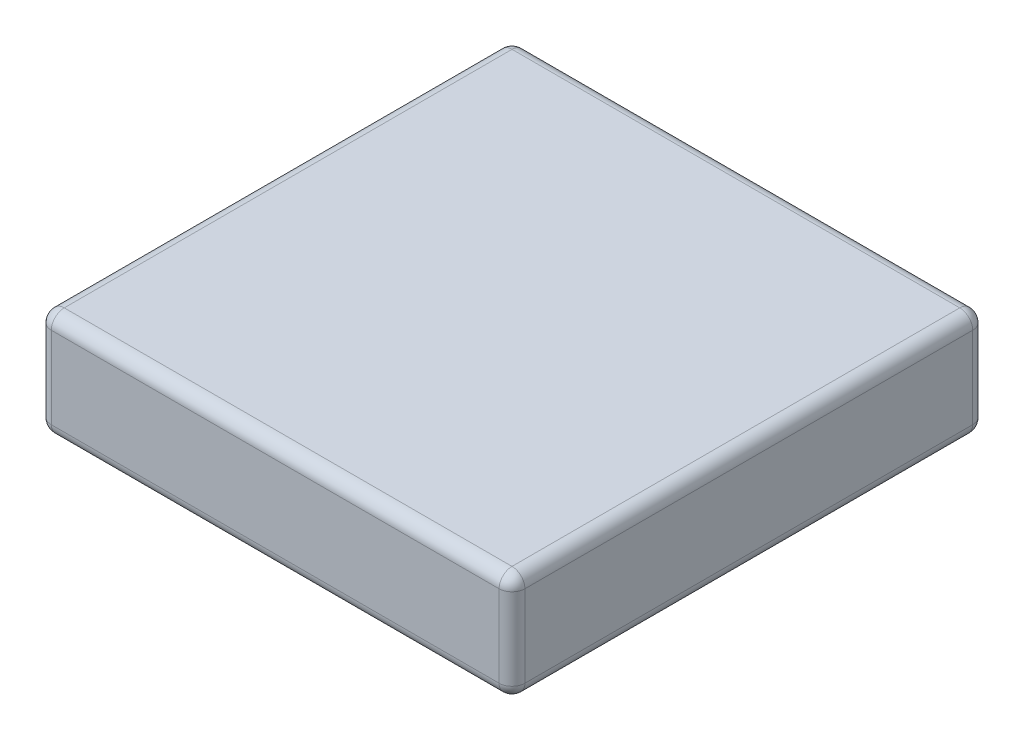
ISO-10303-21;
HEADER;
FILE_DESCRIPTION(('STEP AP214'),'2;1');
FILE_NAME('part.step','',(''),(''),'','','');
FILE_SCHEMA(('AUTOMOTIVE_DESIGN { 1 0 10303 214 1 1 1 1 }'));
ENDSEC;
DATA;
#1=APPLICATION_CONTEXT('core data for automotive mechanical design processes');
#2=APPLICATION_PROTOCOL_DEFINITION('international standard','automotive_design',2000,#1);
#3=PRODUCT_CONTEXT('',#1,'mechanical');
#4=PRODUCT('Part','Part','',(#3));
#5=PRODUCT_RELATED_PRODUCT_CATEGORY('part','',(#4));
#6=PRODUCT_DEFINITION_FORMATION('','',#4);
#7=PRODUCT_DEFINITION_CONTEXT('part definition',#1,'design');
#8=PRODUCT_DEFINITION('design','',#6,#7);
#9=PRODUCT_DEFINITION_SHAPE('','',#8);
#10=(LENGTH_UNIT() NAMED_UNIT(*) SI_UNIT(.MILLI.,.METRE.));
#11=(NAMED_UNIT(*) PLANE_ANGLE_UNIT() SI_UNIT($,.RADIAN.));
#12=(NAMED_UNIT(*) SI_UNIT($,.STERADIAN.) SOLID_ANGLE_UNIT());
#13=UNCERTAINTY_MEASURE_WITH_UNIT(LENGTH_MEASURE(1.E-05),#10,'distance_accuracy_value','');
#14=(GEOMETRIC_REPRESENTATION_CONTEXT(3) GLOBAL_UNCERTAINTY_ASSIGNED_CONTEXT((#13)) GLOBAL_UNIT_ASSIGNED_CONTEXT((#10,
#11,#12)) REPRESENTATION_CONTEXT('',''));
#15=CARTESIAN_POINT('',(0.,0.,0.));
#16=DIRECTION('',(0.,0.,1.));
#17=DIRECTION('',(1.,0.,0.));
#18=AXIS2_PLACEMENT_3D('',#15,#16,#17);
#19=CARTESIAN_POINT('',(55.,25.,55.));
#20=DIRECTION('',(-1.,0.,0.));
#21=DIRECTION('',(0.,0.,1.));
#22=AXIS2_PLACEMENT_3D('',#19,#20,#21);
#23=PLANE('',#22);
#24=DIRECTION('',(0.,0.,-1.));
#25=VECTOR('',#24,1.);
#26=CARTESIAN_POINT('',(55.,22.,55.));
#27=LINE('',#26,#25);
#28=CARTESIAN_POINT('',(55.,22.,-52.));
#29=VERTEX_POINT('',#28);
#30=CARTESIAN_POINT('',(55.,22.,52.));
#31=VERTEX_POINT('',#30);
#32=EDGE_CURVE('E165',#29,#31,#27,.F.);
#33=ORIENTED_EDGE('',*,*,#32,.T.);
#34=DIRECTION('',(0.,-1.,0.));
#35=VECTOR('',#34,1.);
#36=CARTESIAN_POINT('',(55.,25.,52.));
#37=LINE('',#36,#35);
#38=CARTESIAN_POINT('',(55.,3.,52.));
#39=VERTEX_POINT('',#38);
#40=EDGE_CURVE('E168',#31,#39,#37,.T.);
#41=ORIENTED_EDGE('',*,*,#40,.T.);
#42=DIRECTION('',(0.,0.,-1.));
#43=VECTOR('',#42,1.);
#44=CARTESIAN_POINT('',(55.,3.,-55.));
#45=LINE('',#44,#43);
#46=CARTESIAN_POINT('',(55.,3.,-52.));
#47=VERTEX_POINT('',#46);
#48=EDGE_CURVE('E142',#39,#47,#45,.T.);
#49=ORIENTED_EDGE('',*,*,#48,.T.);
#50=DIRECTION('',(0.,-1.,0.));
#51=VECTOR('',#50,1.);
#52=CARTESIAN_POINT('',(55.,25.,-52.));
#53=LINE('',#52,#51);
#54=EDGE_CURVE('E160',#47,#29,#53,.F.);
#55=ORIENTED_EDGE('',*,*,#54,.T.);
#56=EDGE_LOOP('',(#33,#41,#49,#55));
#57=FACE_BOUND('',#56,.T.);
#58=ADVANCED_FACE('F45',(#57),#23,.F.);
#59=CARTESIAN_POINT('',(-55.,25.,-55.));
#60=DIRECTION('',(0.,0.,1.));
#61=DIRECTION('',(1.,0.,0.));
#62=AXIS2_PLACEMENT_3D('',#59,#60,#61);
#63=PLANE('',#62);
#64=DIRECTION('',(-1.,0.,0.));
#65=VECTOR('',#64,1.);
#66=CARTESIAN_POINT('',(-55.,3.,-55.));
#67=LINE('',#66,#65);
#68=CARTESIAN_POINT('',(52.,3.,-55.));
#69=VERTEX_POINT('',#68);
#70=CARTESIAN_POINT('',(-52.,3.,-55.));
#71=VERTEX_POINT('',#70);
#72=EDGE_CURVE('E185',#69,#71,#67,.T.);
#73=ORIENTED_EDGE('',*,*,#72,.T.);
#74=DIRECTION('',(0.,-1.,0.));
#75=VECTOR('',#74,1.);
#76=CARTESIAN_POINT('',(-52.,25.,-55.));
#77=LINE('',#76,#75);
#78=CARTESIAN_POINT('',(-52.,22.,-55.));
#79=VERTEX_POINT('',#78);
#80=EDGE_CURVE('E188',#71,#79,#77,.F.);
#81=ORIENTED_EDGE('',*,*,#80,.T.);
#82=DIRECTION('',(-1.,0.,0.));
#83=VECTOR('',#82,1.);
#84=CARTESIAN_POINT('',(-55.,22.,-55.));
#85=LINE('',#84,#83);
#86=CARTESIAN_POINT('',(52.,22.,-55.));
#87=VERTEX_POINT('',#86);
#88=EDGE_CURVE('E183',#79,#87,#85,.F.);
#89=ORIENTED_EDGE('',*,*,#88,.T.);
#90=DIRECTION('',(0.,-1.,0.));
#91=VECTOR('',#90,1.);
#92=CARTESIAN_POINT('',(52.,25.,-55.));
#93=LINE('',#92,#91);
#94=EDGE_CURVE('E181',#87,#69,#93,.T.);
#95=ORIENTED_EDGE('',*,*,#94,.T.);
#96=EDGE_LOOP('',(#73,#81,#89,#95));
#97=FACE_BOUND('',#96,.T.);
#98=ADVANCED_FACE('F335',(#97),#63,.F.);
#99=CARTESIAN_POINT('',(-55.,25.,55.));
#100=DIRECTION('',(1.,0.,0.));
#101=DIRECTION('',(0.,0.,-1.));
#102=AXIS2_PLACEMENT_3D('',#99,#100,#101);
#103=PLANE('',#102);
#104=DIRECTION('',(0.,0.,1.));
#105=VECTOR('',#104,1.);
#106=CARTESIAN_POINT('',(-55.,3.,55.));
#107=LINE('',#106,#105);
#108=CARTESIAN_POINT('',(-55.,3.,-52.));
#109=VERTEX_POINT('',#108);
#110=CARTESIAN_POINT('',(-55.,3.,52.));
#111=VERTEX_POINT('',#110);
#112=EDGE_CURVE('E194',#109,#111,#107,.T.);
#113=ORIENTED_EDGE('',*,*,#112,.T.);
#114=DIRECTION('',(0.,-1.,0.));
#115=VECTOR('',#114,1.);
#116=CARTESIAN_POINT('',(-55.,25.,52.));
#117=LINE('',#116,#115);
#118=CARTESIAN_POINT('',(-55.,22.,52.));
#119=VERTEX_POINT('',#118);
#120=EDGE_CURVE('E197',#111,#119,#117,.F.);
#121=ORIENTED_EDGE('',*,*,#120,.T.);
#122=DIRECTION('',(0.,0.,1.));
#123=VECTOR('',#122,1.);
#124=CARTESIAN_POINT('',(-55.,22.,55.));
#125=LINE('',#124,#123);
#126=CARTESIAN_POINT('',(-55.,22.,-52.));
#127=VERTEX_POINT('',#126);
#128=EDGE_CURVE('E192',#119,#127,#125,.F.);
#129=ORIENTED_EDGE('',*,*,#128,.T.);
#130=DIRECTION('',(0.,-1.,0.));
#131=VECTOR('',#130,1.);
#132=CARTESIAN_POINT('',(-55.,25.,-52.));
#133=LINE('',#132,#131);
#134=EDGE_CURVE('E190',#127,#109,#133,.T.);
#135=ORIENTED_EDGE('',*,*,#134,.T.);
#136=EDGE_LOOP('',(#113,#121,#129,#135));
#137=FACE_BOUND('',#136,.T.);
#138=ADVANCED_FACE('F305',(#137),#103,.F.);
#139=CARTESIAN_POINT('',(-55.,25.,55.));
#140=DIRECTION('',(0.,0.,-1.));
#141=DIRECTION('',(-1.,0.,0.));
#142=AXIS2_PLACEMENT_3D('',#139,#140,#141);
#143=PLANE('',#142);
#144=DIRECTION('',(0.,-1.,0.));
#145=VECTOR('',#144,1.);
#146=CARTESIAN_POINT('',(-52.,25.,55.));
#147=LINE('',#146,#145);
#148=CARTESIAN_POINT('',(-52.,22.,55.));
#149=VERTEX_POINT('',#148);
#150=CARTESIAN_POINT('',(-52.,3.,55.));
#151=VERTEX_POINT('',#150);
#152=EDGE_CURVE('E201',#149,#151,#147,.T.);
#153=ORIENTED_EDGE('',*,*,#152,.T.);
#154=DIRECTION('',(1.,0.,0.));
#155=VECTOR('',#154,1.);
#156=CARTESIAN_POINT('',(55.,3.,55.));
#157=LINE('',#156,#155);
#158=CARTESIAN_POINT('',(52.,3.,55.));
#159=VERTEX_POINT('',#158);
#160=EDGE_CURVE('E205',#151,#159,#157,.T.);
#161=ORIENTED_EDGE('',*,*,#160,.T.);
#162=DIRECTION('',(0.,-1.,0.));
#163=VECTOR('',#162,1.);
#164=CARTESIAN_POINT('',(52.,25.,55.));
#165=LINE('',#164,#163);
#166=CARTESIAN_POINT('',(52.,22.,55.));
#167=VERTEX_POINT('',#166);
#168=EDGE_CURVE('E203',#159,#167,#165,.F.);
#169=ORIENTED_EDGE('',*,*,#168,.T.);
#170=DIRECTION('',(1.,0.,0.));
#171=VECTOR('',#170,1.);
#172=CARTESIAN_POINT('',(-55.,22.,55.));
#173=LINE('',#172,#171);
#174=EDGE_CURVE('E199',#167,#149,#173,.F.);
#175=ORIENTED_EDGE('',*,*,#174,.T.);
#176=EDGE_LOOP('',(#153,#161,#169,#175));
#177=FACE_BOUND('',#176,.T.);
#178=ADVANCED_FACE('F281',(#177),#143,.F.);
#179=CARTESIAN_POINT('',(0.,25.,0.));
#180=DIRECTION('',(0.,-1.,0.));
#181=DIRECTION('',(0.,0.,-1.));
#182=AXIS2_PLACEMENT_3D('',#179,#180,#181);
#183=PLANE('',#182);
#184=DIRECTION('',(1.,0.,0.));
#185=VECTOR('',#184,1.);
#186=CARTESIAN_POINT('',(0.,25.,52.));
#187=LINE('',#186,#185);
#188=CARTESIAN_POINT('',(-52.,25.,52.));
#189=VERTEX_POINT('',#188);
#190=CARTESIAN_POINT('',(52.,25.,52.));
#191=VERTEX_POINT('',#190);
#192=EDGE_CURVE('E208',#189,#191,#187,.T.);
#193=ORIENTED_EDGE('',*,*,#192,.T.);
#194=DIRECTION('',(0.,0.,-1.));
#195=VECTOR('',#194,1.);
#196=CARTESIAN_POINT('',(52.,25.,0.));
#197=LINE('',#196,#195);
#198=CARTESIAN_POINT('',(52.,25.,-52.));
#199=VERTEX_POINT('',#198);
#200=EDGE_CURVE('E11',#191,#199,#197,.T.);
#201=ORIENTED_EDGE('',*,*,#200,.T.);
#202=DIRECTION('',(-1.,0.,0.));
#203=VECTOR('',#202,1.);
#204=CARTESIAN_POINT('',(0.,25.,-52.));
#205=LINE('',#204,#203);
#206=CARTESIAN_POINT('',(-52.,25.,-52.));
#207=VERTEX_POINT('',#206);
#208=EDGE_CURVE('E54',#199,#207,#205,.T.);
#209=ORIENTED_EDGE('',*,*,#208,.T.);
#210=DIRECTION('',(0.,0.,1.));
#211=VECTOR('',#210,1.);
#212=CARTESIAN_POINT('',(-52.,25.,0.));
#213=LINE('',#212,#211);
#214=EDGE_CURVE('E210',#207,#189,#213,.T.);
#215=ORIENTED_EDGE('',*,*,#214,.T.);
#216=EDGE_LOOP('',(#193,#201,#209,#215));
#217=FACE_BOUND('',#216,.T.);
#218=ADVANCED_FACE('F289',(#217),#183,.F.);
#219=CARTESIAN_POINT('',(0.,0.,0.));
#220=DIRECTION('',(0.,-1.,0.));
#221=DIRECTION('',(0.,0.,-1.));
#222=AXIS2_PLACEMENT_3D('',#219,#220,#221);
#223=PLANE('',#222);
#224=DIRECTION('',(-1.,0.,0.));
#225=VECTOR('',#224,1.);
#226=CARTESIAN_POINT('',(55.,0.,-52.));
#227=LINE('',#226,#225);
#228=CARTESIAN_POINT('',(-52.,0.,-52.));
#229=VERTEX_POINT('',#228);
#230=CARTESIAN_POINT('',(52.,0.,-52.));
#231=VERTEX_POINT('',#230);
#232=EDGE_CURVE('E178',#229,#231,#227,.F.);
#233=ORIENTED_EDGE('',*,*,#232,.T.);
#234=DIRECTION('',(0.,0.,-1.));
#235=VECTOR('',#234,1.);
#236=CARTESIAN_POINT('',(52.,0.,55.));
#237=LINE('',#236,#235);
#238=CARTESIAN_POINT('',(52.,0.,52.));
#239=VERTEX_POINT('',#238);
#240=EDGE_CURVE('E144',#231,#239,#237,.F.);
#241=ORIENTED_EDGE('',*,*,#240,.T.);
#242=DIRECTION('',(1.,0.,0.));
#243=VECTOR('',#242,1.);
#244=CARTESIAN_POINT('',(-55.,0.,52.));
#245=LINE('',#244,#243);
#246=CARTESIAN_POINT('',(-52.,0.,52.));
#247=VERTEX_POINT('',#246);
#248=EDGE_CURVE('E171',#239,#247,#245,.F.);
#249=ORIENTED_EDGE('',*,*,#248,.T.);
#250=DIRECTION('',(0.,0.,1.));
#251=VECTOR('',#250,1.);
#252=CARTESIAN_POINT('',(-52.,0.,-55.));
#253=LINE('',#252,#251);
#254=EDGE_CURVE('E176',#247,#229,#253,.F.);
#255=ORIENTED_EDGE('',*,*,#254,.T.);
#256=EDGE_LOOP('',(#233,#241,#249,#255));
#257=FACE_BOUND('',#256,.T.);
#258=ADVANCED_FACE('F368',(#257),#223,.T.);
#259=CARTESIAN_POINT('',(-52.,22.,0.));
#260=DIRECTION('',(0.,0.,1.));
#261=DIRECTION('',(1.,0.,0.));
#262=AXIS2_PLACEMENT_3D('',#259,#260,#261);
#263=CYLINDRICAL_SURFACE('',#262,3.);
#264=CARTESIAN_POINT('',(-52.,22.,52.));
#265=DIRECTION('',(0.,0.,1.));
#266=DIRECTION('',(1.,0.,0.));
#267=AXIS2_PLACEMENT_3D('',#264,#265,#266);
#268=CIRCLE('',#267,3.);
#269=EDGE_CURVE('E49',#189,#119,#268,.T.);
#270=ORIENTED_EDGE('',*,*,#269,.F.);
#271=ORIENTED_EDGE('',*,*,#214,.F.);
#272=CARTESIAN_POINT('',(-52.,22.,-52.));
#273=DIRECTION('',(0.,0.,-1.));
#274=DIRECTION('',(-1.,0.,0.));
#275=AXIS2_PLACEMENT_3D('',#272,#273,#274);
#276=CIRCLE('',#275,3.);
#277=EDGE_CURVE('E259',#127,#207,#276,.T.);
#278=ORIENTED_EDGE('',*,*,#277,.F.);
#279=ORIENTED_EDGE('',*,*,#128,.F.);
#280=EDGE_LOOP('',(#270,#271,#278,#279));
#281=FACE_BOUND('',#280,.T.);
#282=ADVANCED_FACE('F47',(#281),#263,.T.);
#283=CARTESIAN_POINT('',(-52.,22.,52.));
#284=DIRECTION('',(-1.,0.,0.));
#285=DIRECTION('',(0.,0.,1.));
#286=AXIS2_PLACEMENT_3D('',#283,#284,#285);
#287=SPHERICAL_SURFACE('',#286,3.);
#288=CARTESIAN_POINT('',(-52.,22.,52.));
#289=DIRECTION('',(-1.,0.,0.));
#290=DIRECTION('',(0.,0.,1.));
#291=AXIS2_PLACEMENT_3D('',#288,#289,#290);
#292=CIRCLE('',#291,3.);
#293=EDGE_CURVE('E254',#189,#149,#292,.F.);
#294=ORIENTED_EDGE('',*,*,#293,.F.);
#295=ORIENTED_EDGE('',*,*,#269,.T.);
#296=CARTESIAN_POINT('',(-52.,22.,52.));
#297=DIRECTION('',(0.,1.,0.));
#298=DIRECTION('',(0.,0.,1.));
#299=AXIS2_PLACEMENT_3D('',#296,#297,#298);
#300=CIRCLE('',#299,3.);
#301=EDGE_CURVE('E257',#149,#119,#300,.F.);
#302=ORIENTED_EDGE('',*,*,#301,.F.);
#303=EDGE_LOOP('',(#294,#295,#302));
#304=FACE_BOUND('',#303,.T.);
#305=ADVANCED_FACE('F270',(#304),#287,.T.);
#306=CARTESIAN_POINT('',(-52.,22.,-52.));
#307=DIRECTION('',(0.,1.,0.));
#308=DIRECTION('',(0.,0.,1.));
#309=AXIS2_PLACEMENT_3D('',#306,#307,#308);
#310=SPHERICAL_SURFACE('',#309,3.);
#311=CARTESIAN_POINT('',(-52.,22.,-52.));
#312=DIRECTION('',(0.,1.,0.));
#313=DIRECTION('',(0.,0.,1.));
#314=AXIS2_PLACEMENT_3D('',#311,#312,#313);
#315=CIRCLE('',#314,3.);
#316=EDGE_CURVE('E248',#127,#79,#315,.F.);
#317=ORIENTED_EDGE('',*,*,#316,.F.);
#318=ORIENTED_EDGE('',*,*,#277,.T.);
#319=CARTESIAN_POINT('',(-52.,22.,-52.));
#320=DIRECTION('',(-1.,0.,0.));
#321=DIRECTION('',(0.,0.,1.));
#322=AXIS2_PLACEMENT_3D('',#319,#320,#321);
#323=CIRCLE('',#322,3.);
#324=EDGE_CURVE('E251',#79,#207,#323,.F.);
#325=ORIENTED_EDGE('',*,*,#324,.F.);
#326=EDGE_LOOP('',(#317,#318,#325));
#327=FACE_BOUND('',#326,.T.);
#328=ADVANCED_FACE('F297',(#327),#310,.T.);
#329=CARTESIAN_POINT('',(-52.,25.,52.));
#330=DIRECTION('',(0.,-1.,0.));
#331=DIRECTION('',(0.,0.,-1.));
#332=AXIS2_PLACEMENT_3D('',#329,#330,#331);
#333=CYLINDRICAL_SURFACE('',#332,3.);
#334=ORIENTED_EDGE('',*,*,#301,.T.);
#335=ORIENTED_EDGE('',*,*,#120,.F.);
#336=CARTESIAN_POINT('',(-52.,3.,52.));
#337=DIRECTION('',(0.,-1.,0.));
#338=DIRECTION('',(0.,0.,-1.));
#339=AXIS2_PLACEMENT_3D('',#336,#337,#338);
#340=CIRCLE('',#339,3.);
#341=EDGE_CURVE('E243',#151,#111,#340,.T.);
#342=ORIENTED_EDGE('',*,*,#341,.F.);
#343=ORIENTED_EDGE('',*,*,#152,.F.);
#344=EDGE_LOOP('',(#334,#335,#342,#343));
#345=FACE_BOUND('',#344,.T.);
#346=ADVANCED_FACE('F277',(#345),#333,.T.);
#347=CARTESIAN_POINT('',(0.,22.,52.));
#348=DIRECTION('',(1.,0.,0.));
#349=DIRECTION('',(0.,0.,-1.));
#350=AXIS2_PLACEMENT_3D('',#347,#348,#349);
#351=CYLINDRICAL_SURFACE('',#350,3.);
#352=ORIENTED_EDGE('',*,*,#293,.T.);
#353=ORIENTED_EDGE('',*,*,#174,.F.);
#354=CARTESIAN_POINT('',(52.,22.,52.));
#355=DIRECTION('',(1.,0.,0.));
#356=DIRECTION('',(0.,0.,-1.));
#357=AXIS2_PLACEMENT_3D('',#354,#355,#356);
#358=CIRCLE('',#357,3.);
#359=EDGE_CURVE('E240',#191,#167,#358,.T.);
#360=ORIENTED_EDGE('',*,*,#359,.F.);
#361=ORIENTED_EDGE('',*,*,#192,.F.);
#362=EDGE_LOOP('',(#352,#353,#360,#361));
#363=FACE_BOUND('',#362,.T.);
#364=ADVANCED_FACE('F287',(#363),#351,.T.);
#365=CARTESIAN_POINT('',(52.,22.,0.));
#366=DIRECTION('',(0.,0.,-1.));
#367=DIRECTION('',(-1.,0.,0.));
#368=AXIS2_PLACEMENT_3D('',#365,#366,#367);
#369=CYLINDRICAL_SURFACE('',#368,3.);
#370=CARTESIAN_POINT('',(52.,22.,-52.));
#371=DIRECTION('',(0.,0.,-1.));
#372=DIRECTION('',(-1.,0.,0.));
#373=AXIS2_PLACEMENT_3D('',#370,#371,#372);
#374=CIRCLE('',#373,3.);
#375=EDGE_CURVE('E235',#199,#29,#374,.T.);
#376=ORIENTED_EDGE('',*,*,#375,.F.);
#377=ORIENTED_EDGE('',*,*,#200,.F.);
#378=CARTESIAN_POINT('',(52.,22.,52.));
#379=DIRECTION('',(0.,0.,1.));
#380=DIRECTION('',(1.,0.,0.));
#381=AXIS2_PLACEMENT_3D('',#378,#379,#380);
#382=CIRCLE('',#381,3.);
#383=EDGE_CURVE('E237',#31,#191,#382,.T.);
#384=ORIENTED_EDGE('',*,*,#383,.F.);
#385=ORIENTED_EDGE('',*,*,#32,.F.);
#386=EDGE_LOOP('',(#376,#377,#384,#385));
#387=FACE_BOUND('',#386,.T.);
#388=ADVANCED_FACE('F292',(#387),#369,.T.);
#389=CARTESIAN_POINT('',(0.,22.,-52.));
#390=DIRECTION('',(-1.,0.,0.));
#391=DIRECTION('',(0.,0.,1.));
#392=AXIS2_PLACEMENT_3D('',#389,#390,#391);
#393=CYLINDRICAL_SURFACE('',#392,3.);
#394=ORIENTED_EDGE('',*,*,#324,.T.);
#395=ORIENTED_EDGE('',*,*,#208,.F.);
#396=CARTESIAN_POINT('',(52.,22.,-52.));
#397=DIRECTION('',(1.,0.,0.));
#398=DIRECTION('',(0.,0.,-1.));
#399=AXIS2_PLACEMENT_3D('',#396,#397,#398);
#400=CIRCLE('',#399,3.);
#401=EDGE_CURVE('E62',#87,#199,#400,.T.);
#402=ORIENTED_EDGE('',*,*,#401,.F.);
#403=ORIENTED_EDGE('',*,*,#88,.F.);
#404=EDGE_LOOP('',(#394,#395,#402,#403));
#405=FACE_BOUND('',#404,.T.);
#406=ADVANCED_FACE('F295',(#405),#393,.T.);
#407=CARTESIAN_POINT('',(-52.,25.,-52.));
#408=DIRECTION('',(0.,-1.,0.));
#409=DIRECTION('',(0.,0.,-1.));
#410=AXIS2_PLACEMENT_3D('',#407,#408,#409);
#411=CYLINDRICAL_SURFACE('',#410,3.);
#412=ORIENTED_EDGE('',*,*,#316,.T.);
#413=ORIENTED_EDGE('',*,*,#80,.F.);
#414=CARTESIAN_POINT('',(-52.,3.,-52.));
#415=DIRECTION('',(0.,-1.,0.));
#416=DIRECTION('',(0.,0.,-1.));
#417=AXIS2_PLACEMENT_3D('',#414,#415,#416);
#418=CIRCLE('',#417,3.);
#419=EDGE_CURVE('E231',#109,#71,#418,.T.);
#420=ORIENTED_EDGE('',*,*,#419,.F.);
#421=ORIENTED_EDGE('',*,*,#134,.F.);
#422=EDGE_LOOP('',(#412,#413,#420,#421));
#423=FACE_BOUND('',#422,.T.);
#424=ADVANCED_FACE('F302',(#423),#411,.T.);
#425=CARTESIAN_POINT('',(-52.,3.,55.));
#426=DIRECTION('',(0.,0.,-1.));
#427=DIRECTION('',(-1.,0.,0.));
#428=AXIS2_PLACEMENT_3D('',#425,#426,#427);
#429=CYLINDRICAL_SURFACE('',#428,3.);
#430=CARTESIAN_POINT('',(-52.,3.,52.));
#431=DIRECTION('',(0.,0.,1.));
#432=DIRECTION('',(1.,0.,0.));
#433=AXIS2_PLACEMENT_3D('',#430,#431,#432);
#434=CIRCLE('',#433,3.);
#435=EDGE_CURVE('E245',#111,#247,#434,.T.);
#436=ORIENTED_EDGE('',*,*,#435,.F.);
#437=ORIENTED_EDGE('',*,*,#112,.F.);
#438=CARTESIAN_POINT('',(-52.,3.,-52.));
#439=DIRECTION('',(0.,0.,-1.));
#440=DIRECTION('',(-1.,0.,0.));
#441=AXIS2_PLACEMENT_3D('',#438,#439,#440);
#442=CIRCLE('',#441,3.);
#443=EDGE_CURVE('E228',#229,#109,#442,.T.);
#444=ORIENTED_EDGE('',*,*,#443,.F.);
#445=ORIENTED_EDGE('',*,*,#254,.F.);
#446=EDGE_LOOP('',(#436,#437,#444,#445));
#447=FACE_BOUND('',#446,.T.);
#448=ADVANCED_FACE('F309',(#447),#429,.T.);
#449=CARTESIAN_POINT('',(-52.,3.,52.));
#450=DIRECTION('',(-1.,0.,0.));
#451=DIRECTION('',(0.,-1.,0.));
#452=AXIS2_PLACEMENT_3D('',#449,#450,#451);
#453=SPHERICAL_SURFACE('',#452,3.);
#454=ORIENTED_EDGE('',*,*,#341,.T.);
#455=ORIENTED_EDGE('',*,*,#435,.T.);
#456=CARTESIAN_POINT('',(-52.,3.,52.));
#457=DIRECTION('',(-1.,0.,0.));
#458=DIRECTION('',(0.,0.,1.));
#459=AXIS2_PLACEMENT_3D('',#456,#457,#458);
#460=CIRCLE('',#459,3.);
#461=EDGE_CURVE('E225',#151,#247,#460,.F.);
#462=ORIENTED_EDGE('',*,*,#461,.F.);
#463=EDGE_LOOP('',(#454,#455,#462));
#464=FACE_BOUND('',#463,.T.);
#465=ADVANCED_FACE('F313',(#464),#453,.T.);
#466=CARTESIAN_POINT('',(52.,22.,52.));
#467=DIRECTION('',(0.,1.,0.));
#468=DIRECTION('',(0.,0.,1.));
#469=AXIS2_PLACEMENT_3D('',#466,#467,#468);
#470=SPHERICAL_SURFACE('',#469,3.);
#471=ORIENTED_EDGE('',*,*,#383,.T.);
#472=ORIENTED_EDGE('',*,*,#359,.T.);
#473=CARTESIAN_POINT('',(52.,22.,52.));
#474=DIRECTION('',(0.,1.,0.));
#475=DIRECTION('',(0.,0.,1.));
#476=AXIS2_PLACEMENT_3D('',#473,#474,#475);
#477=CIRCLE('',#476,3.);
#478=EDGE_CURVE('E222',#31,#167,#477,.F.);
#479=ORIENTED_EDGE('',*,*,#478,.F.);
#480=EDGE_LOOP('',(#471,#472,#479));
#481=FACE_BOUND('',#480,.T.);
#482=ADVANCED_FACE('F323',(#481),#470,.T.);
#483=CARTESIAN_POINT('',(52.,22.,-52.));
#484=DIRECTION('',(0.,1.,0.));
#485=DIRECTION('',(0.,0.,1.));
#486=AXIS2_PLACEMENT_3D('',#483,#484,#485);
#487=SPHERICAL_SURFACE('',#486,3.);
#488=ORIENTED_EDGE('',*,*,#401,.T.);
#489=ORIENTED_EDGE('',*,*,#375,.T.);
#490=CARTESIAN_POINT('',(52.,22.,-52.));
#491=DIRECTION('',(0.,1.,0.));
#492=DIRECTION('',(0.,0.,1.));
#493=AXIS2_PLACEMENT_3D('',#490,#491,#492);
#494=CIRCLE('',#493,3.);
#495=EDGE_CURVE('E162',#87,#29,#494,.F.);
#496=ORIENTED_EDGE('',*,*,#495,.F.);
#497=EDGE_LOOP('',(#488,#489,#496));
#498=FACE_BOUND('',#497,.T.);
#499=ADVANCED_FACE('F325',(#498),#487,.T.);
#500=CARTESIAN_POINT('',(-52.,3.,-52.));
#501=DIRECTION('',(-1.,0.,0.));
#502=DIRECTION('',(0.,-1.,0.));
#503=AXIS2_PLACEMENT_3D('',#500,#501,#502);
#504=SPHERICAL_SURFACE('',#503,3.);
#505=ORIENTED_EDGE('',*,*,#443,.T.);
#506=ORIENTED_EDGE('',*,*,#419,.T.);
#507=CARTESIAN_POINT('',(-52.,3.,-52.));
#508=DIRECTION('',(-1.,0.,0.));
#509=DIRECTION('',(0.,0.,1.));
#510=AXIS2_PLACEMENT_3D('',#507,#508,#509);
#511=CIRCLE('',#510,3.);
#512=EDGE_CURVE('E219',#229,#71,#511,.F.);
#513=ORIENTED_EDGE('',*,*,#512,.F.);
#514=EDGE_LOOP('',(#505,#506,#513));
#515=FACE_BOUND('',#514,.T.);
#516=ADVANCED_FACE('F331',(#515),#504,.T.);
#517=CARTESIAN_POINT('',(-55.,3.,52.));
#518=DIRECTION('',(-1.,0.,0.));
#519=DIRECTION('',(0.,0.,1.));
#520=AXIS2_PLACEMENT_3D('',#517,#518,#519);
#521=CYLINDRICAL_SURFACE('',#520,3.);
#522=ORIENTED_EDGE('',*,*,#461,.T.);
#523=ORIENTED_EDGE('',*,*,#248,.F.);
#524=CARTESIAN_POINT('',(52.,3.,52.));
#525=DIRECTION('',(1.,0.,0.));
#526=DIRECTION('',(0.,0.,-1.));
#527=AXIS2_PLACEMENT_3D('',#524,#525,#526);
#528=CIRCLE('',#527,3.);
#529=EDGE_CURVE('E216',#159,#239,#528,.T.);
#530=ORIENTED_EDGE('',*,*,#529,.F.);
#531=ORIENTED_EDGE('',*,*,#160,.F.);
#532=EDGE_LOOP('',(#522,#523,#530,#531));
#533=FACE_BOUND('',#532,.T.);
#534=ADVANCED_FACE('F316',(#533),#521,.T.);
#535=CARTESIAN_POINT('',(52.,25.,52.));
#536=DIRECTION('',(0.,-1.,0.));
#537=DIRECTION('',(0.,0.,-1.));
#538=AXIS2_PLACEMENT_3D('',#535,#536,#537);
#539=CYLINDRICAL_SURFACE('',#538,3.);
#540=ORIENTED_EDGE('',*,*,#478,.T.);
#541=ORIENTED_EDGE('',*,*,#168,.F.);
#542=CARTESIAN_POINT('',(52.,3.,52.));
#543=DIRECTION('',(0.,-1.,0.));
#544=DIRECTION('',(0.,0.,-1.));
#545=AXIS2_PLACEMENT_3D('',#542,#543,#544);
#546=CIRCLE('',#545,3.);
#547=EDGE_CURVE('E157',#39,#159,#546,.T.);
#548=ORIENTED_EDGE('',*,*,#547,.F.);
#549=ORIENTED_EDGE('',*,*,#40,.F.);
#550=EDGE_LOOP('',(#540,#541,#548,#549));
#551=FACE_BOUND('',#550,.T.);
#552=ADVANCED_FACE('F321',(#551),#539,.T.);
#553=CARTESIAN_POINT('',(52.,25.,-52.));
#554=DIRECTION('',(0.,-1.,0.));
#555=DIRECTION('',(0.,0.,-1.));
#556=AXIS2_PLACEMENT_3D('',#553,#554,#555);
#557=CYLINDRICAL_SURFACE('',#556,3.);
#558=ORIENTED_EDGE('',*,*,#495,.T.);
#559=ORIENTED_EDGE('',*,*,#54,.F.);
#560=CARTESIAN_POINT('',(52.,3.,-52.));
#561=DIRECTION('',(0.,-1.,0.));
#562=DIRECTION('',(0.,0.,-1.));
#563=AXIS2_PLACEMENT_3D('',#560,#561,#562);
#564=CIRCLE('',#563,3.);
#565=EDGE_CURVE('E150',#69,#47,#564,.T.);
#566=ORIENTED_EDGE('',*,*,#565,.F.);
#567=ORIENTED_EDGE('',*,*,#94,.F.);
#568=EDGE_LOOP('',(#558,#559,#566,#567));
#569=FACE_BOUND('',#568,.T.);
#570=ADVANCED_FACE('F161',(#569),#557,.T.);
#571=CARTESIAN_POINT('',(-55.,3.,-52.));
#572=DIRECTION('',(1.,0.,0.));
#573=DIRECTION('',(0.,0.,-1.));
#574=AXIS2_PLACEMENT_3D('',#571,#572,#573);
#575=CYLINDRICAL_SURFACE('',#574,3.);
#576=ORIENTED_EDGE('',*,*,#512,.T.);
#577=ORIENTED_EDGE('',*,*,#72,.F.);
#578=CARTESIAN_POINT('',(52.,3.,-52.));
#579=DIRECTION('',(1.,0.,0.));
#580=DIRECTION('',(0.,0.,-1.));
#581=AXIS2_PLACEMENT_3D('',#578,#579,#580);
#582=CIRCLE('',#581,3.);
#583=EDGE_CURVE('E154',#231,#69,#582,.T.);
#584=ORIENTED_EDGE('',*,*,#583,.F.);
#585=ORIENTED_EDGE('',*,*,#232,.F.);
#586=EDGE_LOOP('',(#576,#577,#584,#585));
#587=FACE_BOUND('',#586,.T.);
#588=ADVANCED_FACE('F351',(#587),#575,.T.);
#589=CARTESIAN_POINT('',(52.,3.,52.));
#590=DIRECTION('',(0.,0.,1.));
#591=DIRECTION('',(0.,-1.,0.));
#592=AXIS2_PLACEMENT_3D('',#589,#590,#591);
#593=SPHERICAL_SURFACE('',#592,3.);
#594=ORIENTED_EDGE('',*,*,#547,.T.);
#595=ORIENTED_EDGE('',*,*,#529,.T.);
#596=CARTESIAN_POINT('',(52.,3.,52.));
#597=DIRECTION('',(0.,0.,1.));
#598=DIRECTION('',(1.,0.,0.));
#599=AXIS2_PLACEMENT_3D('',#596,#597,#598);
#600=CIRCLE('',#599,3.);
#601=EDGE_CURVE('E147',#39,#239,#600,.F.);
#602=ORIENTED_EDGE('',*,*,#601,.F.);
#603=EDGE_LOOP('',(#594,#595,#602));
#604=FACE_BOUND('',#603,.T.);
#605=ADVANCED_FACE('F348',(#604),#593,.T.);
#606=CARTESIAN_POINT('',(52.,3.,-52.));
#607=DIRECTION('',(0.,0.,-1.));
#608=DIRECTION('',(0.,1.,0.));
#609=AXIS2_PLACEMENT_3D('',#606,#607,#608);
#610=SPHERICAL_SURFACE('',#609,3.);
#611=ORIENTED_EDGE('',*,*,#583,.T.);
#612=ORIENTED_EDGE('',*,*,#565,.T.);
#613=CARTESIAN_POINT('',(52.,3.,-52.));
#614=DIRECTION('',(0.,0.,-1.));
#615=DIRECTION('',(-1.,0.,0.));
#616=AXIS2_PLACEMENT_3D('',#613,#614,#615);
#617=CIRCLE('',#616,3.);
#618=EDGE_CURVE('E138',#231,#47,#617,.F.);
#619=ORIENTED_EDGE('',*,*,#618,.F.);
#620=EDGE_LOOP('',(#611,#612,#619));
#621=FACE_BOUND('',#620,.T.);
#622=ADVANCED_FACE('F152',(#621),#610,.T.);
#623=CARTESIAN_POINT('',(52.,3.,55.));
#624=DIRECTION('',(0.,0.,1.));
#625=DIRECTION('',(1.,0.,0.));
#626=AXIS2_PLACEMENT_3D('',#623,#624,#625);
#627=CYLINDRICAL_SURFACE('',#626,3.);
#628=ORIENTED_EDGE('',*,*,#601,.T.);
#629=ORIENTED_EDGE('',*,*,#240,.F.);
#630=ORIENTED_EDGE('',*,*,#618,.T.);
#631=ORIENTED_EDGE('',*,*,#48,.F.);
#632=EDGE_LOOP('',(#628,#629,#630,#631));
#633=FACE_BOUND('',#632,.T.);
#634=ADVANCED_FACE('F140',(#633),#627,.T.);
#635=CLOSED_SHELL('',(#58,#98,#138,#178,#218,#258,#282,#305,#328,#346,#364,#388,#406,#424,#448,
#465,#482,#499,#516,#534,#552,#570,#588,#605,#622,#634));
#636=MANIFOLD_SOLID_BREP('B2',#635);
#637=ADVANCED_BREP_SHAPE_REPRESENTATION('',(#18,#636),#14);
#638=SHAPE_DEFINITION_REPRESENTATION(#9,#637);
ENDSEC;
END-ISO-10303-21;
